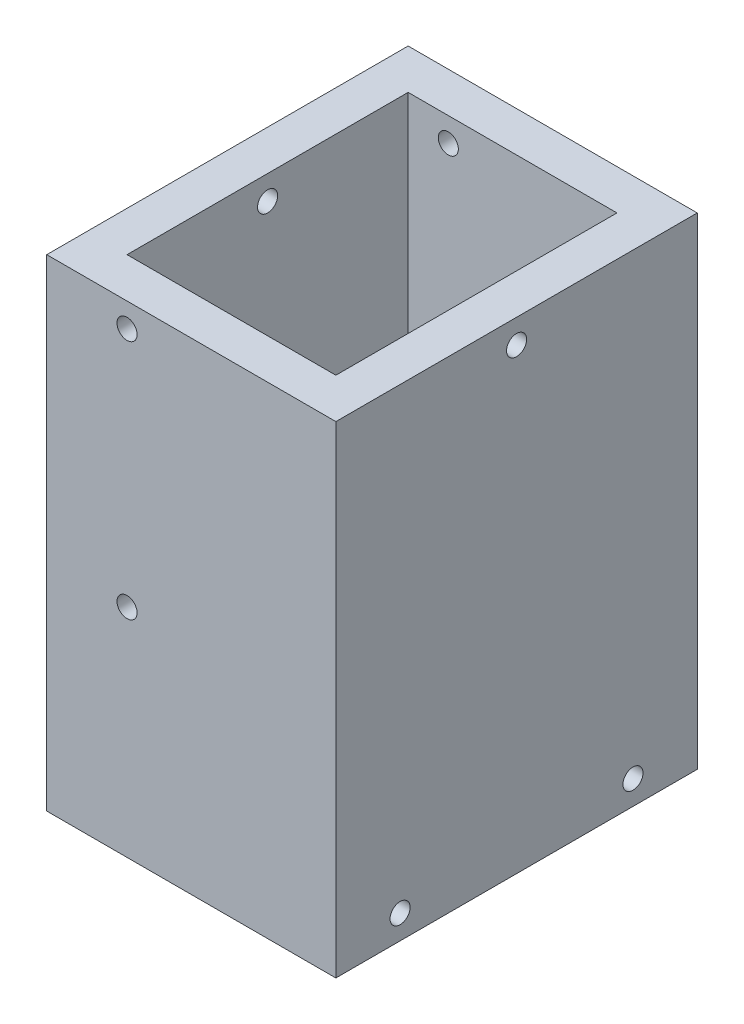
ISO-10303-21;
HEADER;
FILE_DESCRIPTION(('STEP AP214'),'2;1');
FILE_NAME('part.step','',(''),(''),'','','');
FILE_SCHEMA(('AUTOMOTIVE_DESIGN { 1 0 10303 214 1 1 1 1 }'));
ENDSEC;
DATA;
#1=APPLICATION_CONTEXT('core data for automotive mechanical design processes');
#2=APPLICATION_PROTOCOL_DEFINITION('international standard','automotive_design',2000,#1);
#3=PRODUCT_CONTEXT('',#1,'mechanical');
#4=PRODUCT('Part','Part','',(#3));
#5=PRODUCT_RELATED_PRODUCT_CATEGORY('part','',(#4));
#6=PRODUCT_DEFINITION_FORMATION('','',#4);
#7=PRODUCT_DEFINITION_CONTEXT('part definition',#1,'design');
#8=PRODUCT_DEFINITION('design','',#6,#7);
#9=PRODUCT_DEFINITION_SHAPE('','',#8);
#10=(LENGTH_UNIT() NAMED_UNIT(*) SI_UNIT(.MILLI.,.METRE.));
#11=(NAMED_UNIT(*) PLANE_ANGLE_UNIT() SI_UNIT($,.RADIAN.));
#12=(NAMED_UNIT(*) SI_UNIT($,.STERADIAN.) SOLID_ANGLE_UNIT());
#13=UNCERTAINTY_MEASURE_WITH_UNIT(LENGTH_MEASURE(1.E-05),#10,'distance_accuracy_value','');
#14=(GEOMETRIC_REPRESENTATION_CONTEXT(3) GLOBAL_UNCERTAINTY_ASSIGNED_CONTEXT((#13)) GLOBAL_UNIT_ASSIGNED_CONTEXT((#10,
#11,#12)) REPRESENTATION_CONTEXT('',''));
#15=CARTESIAN_POINT('',(0.,0.,0.));
#16=DIRECTION('',(0.,0.,1.));
#17=DIRECTION('',(1.,0.,0.));
#18=AXIS2_PLACEMENT_3D('',#15,#16,#17);
#19=CARTESIAN_POINT('',(0.,60.,0.));
#20=DIRECTION('',(0.,1.,0.));
#21=DIRECTION('',(0.,0.,1.));
#22=AXIS2_PLACEMENT_3D('',#19,#20,#21);
#23=PLANE('',#22);
#24=DIRECTION('',(0.,0.,-1.));
#25=VECTOR('',#24,1.);
#26=CARTESIAN_POINT('',(18.,60.,-22.5));
#27=LINE('',#26,#25);
#28=CARTESIAN_POINT('',(18.,60.,22.5));
#29=VERTEX_POINT('',#28);
#30=CARTESIAN_POINT('',(18.,60.,-22.5));
#31=VERTEX_POINT('',#30);
#32=EDGE_CURVE('E141',#29,#31,#27,.T.);
#33=ORIENTED_EDGE('',*,*,#32,.T.);
#34=DIRECTION('',(-1.,0.,0.));
#35=VECTOR('',#34,1.);
#36=CARTESIAN_POINT('',(-18.,60.,-22.5));
#37=LINE('',#36,#35);
#38=CARTESIAN_POINT('',(-18.,60.,-22.5));
#39=VERTEX_POINT('',#38);
#40=EDGE_CURVE('E144',#31,#39,#37,.T.);
#41=ORIENTED_EDGE('',*,*,#40,.T.);
#42=DIRECTION('',(0.,0.,1.));
#43=VECTOR('',#42,1.);
#44=CARTESIAN_POINT('',(-18.,60.,-22.5));
#45=LINE('',#44,#43);
#46=CARTESIAN_POINT('',(-18.,60.,22.5));
#47=VERTEX_POINT('',#46);
#48=EDGE_CURVE('E147',#39,#47,#45,.T.);
#49=ORIENTED_EDGE('',*,*,#48,.T.);
#50=DIRECTION('',(1.,0.,0.));
#51=VECTOR('',#50,1.);
#52=CARTESIAN_POINT('',(-18.,60.,22.5));
#53=LINE('',#52,#51);
#54=EDGE_CURVE('E149',#47,#29,#53,.T.);
#55=ORIENTED_EDGE('',*,*,#54,.T.);
#56=EDGE_LOOP('',(#33,#41,#49,#55));
#57=FACE_BOUND('',#56,.T.);
#58=DIRECTION('',(-1.,0.,0.));
#59=VECTOR('',#58,1.);
#60=CARTESIAN_POINT('',(-13.,60.,-17.5));
#61=LINE('',#60,#59);
#62=CARTESIAN_POINT('',(13.,60.,-17.5));
#63=VERTEX_POINT('',#62);
#64=CARTESIAN_POINT('',(-13.,60.,-17.5));
#65=VERTEX_POINT('',#64);
#66=EDGE_CURVE('E111',#63,#65,#61,.T.);
#67=ORIENTED_EDGE('',*,*,#66,.F.);
#68=DIRECTION('',(0.,0.,-1.));
#69=VECTOR('',#68,1.);
#70=CARTESIAN_POINT('',(13.,60.,17.5));
#71=LINE('',#70,#69);
#72=CARTESIAN_POINT('',(13.,60.,17.5));
#73=VERTEX_POINT('',#72);
#74=EDGE_CURVE('E103',#73,#63,#71,.T.);
#75=ORIENTED_EDGE('',*,*,#74,.F.);
#76=DIRECTION('',(1.,0.,0.));
#77=VECTOR('',#76,1.);
#78=CARTESIAN_POINT('',(-13.,60.,17.5));
#79=LINE('',#78,#77);
#80=CARTESIAN_POINT('',(-13.,60.,17.5));
#81=VERTEX_POINT('',#80);
#82=EDGE_CURVE('E125',#81,#73,#79,.T.);
#83=ORIENTED_EDGE('',*,*,#82,.F.);
#84=DIRECTION('',(0.,0.,1.));
#85=VECTOR('',#84,1.);
#86=CARTESIAN_POINT('',(-13.,60.,17.5));
#87=LINE('',#86,#85);
#88=EDGE_CURVE('E123',#65,#81,#87,.T.);
#89=ORIENTED_EDGE('',*,*,#88,.F.);
#90=EDGE_LOOP('',(#67,#75,#83,#89));
#91=FACE_BOUND('',#90,.T.);
#92=ADVANCED_FACE('F36',(#57,#91),#23,.T.);
#93=CARTESIAN_POINT('',(0.,0.,0.));
#94=DIRECTION('',(0.,1.,0.));
#95=DIRECTION('',(0.,0.,1.));
#96=AXIS2_PLACEMENT_3D('',#93,#94,#95);
#97=PLANE('',#96);
#98=DIRECTION('',(0.,0.,-1.));
#99=VECTOR('',#98,1.);
#100=CARTESIAN_POINT('',(18.,0.,-22.5));
#101=LINE('',#100,#99);
#102=CARTESIAN_POINT('',(18.,0.,22.5));
#103=VERTEX_POINT('',#102);
#104=CARTESIAN_POINT('',(18.,0.,-22.5));
#105=VERTEX_POINT('',#104);
#106=EDGE_CURVE('E119',#103,#105,#101,.T.);
#107=ORIENTED_EDGE('',*,*,#106,.F.);
#108=DIRECTION('',(1.,0.,0.));
#109=VECTOR('',#108,1.);
#110=CARTESIAN_POINT('',(-18.,0.,22.5));
#111=LINE('',#110,#109);
#112=CARTESIAN_POINT('',(-18.,0.,22.5));
#113=VERTEX_POINT('',#112);
#114=EDGE_CURVE('E145',#113,#103,#111,.T.);
#115=ORIENTED_EDGE('',*,*,#114,.F.);
#116=DIRECTION('',(0.,0.,1.));
#117=VECTOR('',#116,1.);
#118=CARTESIAN_POINT('',(-18.,0.,-22.5));
#119=LINE('',#118,#117);
#120=CARTESIAN_POINT('',(-18.,0.,-22.5));
#121=VERTEX_POINT('',#120);
#122=EDGE_CURVE('E156',#121,#113,#119,.T.);
#123=ORIENTED_EDGE('',*,*,#122,.F.);
#124=DIRECTION('',(-1.,0.,0.));
#125=VECTOR('',#124,1.);
#126=CARTESIAN_POINT('',(-18.,0.,-22.5));
#127=LINE('',#126,#125);
#128=EDGE_CURVE('E154',#105,#121,#127,.T.);
#129=ORIENTED_EDGE('',*,*,#128,.F.);
#130=EDGE_LOOP('',(#107,#115,#123,#129));
#131=FACE_BOUND('',#130,.T.);
#132=DIRECTION('',(0.,0.,-1.));
#133=VECTOR('',#132,1.);
#134=CARTESIAN_POINT('',(13.,0.,17.5));
#135=LINE('',#134,#133);
#136=CARTESIAN_POINT('',(13.,0.,17.5));
#137=VERTEX_POINT('',#136);
#138=CARTESIAN_POINT('',(13.,0.,-17.5));
#139=VERTEX_POINT('',#138);
#140=EDGE_CURVE('E61',#137,#139,#135,.T.);
#141=ORIENTED_EDGE('',*,*,#140,.T.);
#142=DIRECTION('',(-1.,0.,0.));
#143=VECTOR('',#142,1.);
#144=CARTESIAN_POINT('',(-13.,0.,-17.5));
#145=LINE('',#144,#143);
#146=CARTESIAN_POINT('',(-13.,0.,-17.5));
#147=VERTEX_POINT('',#146);
#148=EDGE_CURVE('E118',#139,#147,#145,.T.);
#149=ORIENTED_EDGE('',*,*,#148,.T.);
#150=DIRECTION('',(0.,0.,1.));
#151=VECTOR('',#150,1.);
#152=CARTESIAN_POINT('',(-13.,0.,17.5));
#153=LINE('',#152,#151);
#154=CARTESIAN_POINT('',(-13.,0.,17.5));
#155=VERTEX_POINT('',#154);
#156=EDGE_CURVE('E133',#147,#155,#153,.T.);
#157=ORIENTED_EDGE('',*,*,#156,.T.);
#158=DIRECTION('',(1.,0.,0.));
#159=VECTOR('',#158,1.);
#160=CARTESIAN_POINT('',(-13.,0.,17.5));
#161=LINE('',#160,#159);
#162=EDGE_CURVE('E112',#155,#137,#161,.T.);
#163=ORIENTED_EDGE('',*,*,#162,.T.);
#164=EDGE_LOOP('',(#141,#149,#157,#163));
#165=FACE_BOUND('',#164,.T.);
#166=ADVANCED_FACE('F240',(#131,#165),#97,.F.);
#167=CARTESIAN_POINT('',(18.,60.,-22.5));
#168=DIRECTION('',(-1.,0.,0.));
#169=DIRECTION('',(0.,0.,1.));
#170=AXIS2_PLACEMENT_3D('',#167,#168,#169);
#171=PLANE('',#170);
#172=CARTESIAN_POINT('',(18.,57.,0.));
#173=DIRECTION('',(1.,0.,0.));
#174=DIRECTION('',(0.,0.,-1.));
#175=AXIS2_PLACEMENT_3D('',#172,#173,#174);
#176=CIRCLE('',#175,1.25);
#177=CARTESIAN_POINT('',(18.,57.,-1.25));
#178=VERTEX_POINT('',#177);
#179=EDGE_CURVE('E319',#178,#178,#176,.T.);
#180=ORIENTED_EDGE('',*,*,#179,.F.);
#181=EDGE_LOOP('',(#180));
#182=FACE_BOUND('',#181,.T.);
#183=CARTESIAN_POINT('',(18.,3.,-14.5));
#184=DIRECTION('',(-1.,0.,0.));
#185=DIRECTION('',(0.,0.,1.));
#186=AXIS2_PLACEMENT_3D('',#183,#184,#185);
#187=CIRCLE('',#186,1.25);
#188=CARTESIAN_POINT('',(18.,3.,-13.25));
#189=VERTEX_POINT('',#188);
#190=EDGE_CURVE('E174',#189,#189,#187,.T.);
#191=ORIENTED_EDGE('',*,*,#190,.T.);
#192=EDGE_LOOP('',(#191));
#193=FACE_BOUND('',#192,.T.);
#194=CARTESIAN_POINT('',(18.,3.,14.5));
#195=DIRECTION('',(-1.,0.,0.));
#196=DIRECTION('',(0.,0.,1.));
#197=AXIS2_PLACEMENT_3D('',#194,#195,#196);
#198=CIRCLE('',#197,1.25);
#199=CARTESIAN_POINT('',(18.,3.,15.75));
#200=VERTEX_POINT('',#199);
#201=EDGE_CURVE('E169',#200,#200,#198,.T.);
#202=ORIENTED_EDGE('',*,*,#201,.T.);
#203=EDGE_LOOP('',(#202));
#204=FACE_BOUND('',#203,.T.);
#205=ORIENTED_EDGE('',*,*,#106,.T.);
#206=DIRECTION('',(0.,-1.,0.));
#207=VECTOR('',#206,1.);
#208=CARTESIAN_POINT('',(18.,60.,-22.5));
#209=LINE('',#208,#207);
#210=EDGE_CURVE('E11',#31,#105,#209,.T.);
#211=ORIENTED_EDGE('',*,*,#210,.F.);
#212=ORIENTED_EDGE('',*,*,#32,.F.);
#213=DIRECTION('',(0.,-1.,0.));
#214=VECTOR('',#213,1.);
#215=CARTESIAN_POINT('',(18.,60.,22.5));
#216=LINE('',#215,#214);
#217=EDGE_CURVE('E151',#29,#103,#216,.T.);
#218=ORIENTED_EDGE('',*,*,#217,.T.);
#219=EDGE_LOOP('',(#205,#211,#212,#218));
#220=FACE_BOUND('',#219,.T.);
#221=ADVANCED_FACE('F38',(#182,#193,#204,#220),#171,.F.);
#222=CARTESIAN_POINT('',(-18.,60.,-22.5));
#223=DIRECTION('',(0.,0.,1.));
#224=DIRECTION('',(1.,0.,0.));
#225=AXIS2_PLACEMENT_3D('',#222,#223,#224);
#226=PLANE('',#225);
#227=CARTESIAN_POINT('',(-7.99999999999999,27.,-22.5));
#228=DIRECTION('',(0.,0.,1.));
#229=DIRECTION('',(1.,0.,0.));
#230=AXIS2_PLACEMENT_3D('',#227,#228,#229);
#231=CIRCLE('',#230,1.25);
#232=CARTESIAN_POINT('',(-6.74999999999999,27.,-22.5));
#233=VERTEX_POINT('',#232);
#234=EDGE_CURVE('E182',#233,#233,#231,.T.);
#235=ORIENTED_EDGE('',*,*,#234,.T.);
#236=EDGE_LOOP('',(#235));
#237=FACE_BOUND('',#236,.T.);
#238=CARTESIAN_POINT('',(-7.99999999999999,57.,-22.5));
#239=DIRECTION('',(0.,0.,1.));
#240=DIRECTION('',(1.,0.,0.));
#241=AXIS2_PLACEMENT_3D('',#238,#239,#240);
#242=CIRCLE('',#241,1.25);
#243=CARTESIAN_POINT('',(-6.74999999999999,57.,-22.5));
#244=VERTEX_POINT('',#243);
#245=EDGE_CURVE('E178',#244,#244,#242,.T.);
#246=ORIENTED_EDGE('',*,*,#245,.T.);
#247=EDGE_LOOP('',(#246));
#248=FACE_BOUND('',#247,.T.);
#249=ORIENTED_EDGE('',*,*,#128,.T.);
#250=DIRECTION('',(0.,-1.,0.));
#251=VECTOR('',#250,1.);
#252=CARTESIAN_POINT('',(-18.,60.,-22.5));
#253=LINE('',#252,#251);
#254=EDGE_CURVE('E45',#39,#121,#253,.T.);
#255=ORIENTED_EDGE('',*,*,#254,.F.);
#256=ORIENTED_EDGE('',*,*,#40,.F.);
#257=ORIENTED_EDGE('',*,*,#210,.T.);
#258=EDGE_LOOP('',(#249,#255,#256,#257));
#259=FACE_BOUND('',#258,.T.);
#260=ADVANCED_FACE('F249',(#237,#248,#259),#226,.F.);
#261=CARTESIAN_POINT('',(-18.,60.,-22.5));
#262=DIRECTION('',(1.,0.,0.));
#263=DIRECTION('',(0.,0.,-1.));
#264=AXIS2_PLACEMENT_3D('',#261,#262,#263);
#265=PLANE('',#264);
#266=CARTESIAN_POINT('',(-18.,57.,0.));
#267=DIRECTION('',(1.,0.,0.));
#268=DIRECTION('',(0.,0.,-1.));
#269=AXIS2_PLACEMENT_3D('',#266,#267,#268);
#270=CIRCLE('',#269,1.25);
#271=CARTESIAN_POINT('',(-18.,57.,-1.25));
#272=VERTEX_POINT('',#271);
#273=EDGE_CURVE('E318',#272,#272,#270,.T.);
#274=ORIENTED_EDGE('',*,*,#273,.T.);
#275=EDGE_LOOP('',(#274));
#276=FACE_BOUND('',#275,.T.);
#277=CARTESIAN_POINT('',(-18.,3.,-14.5));
#278=DIRECTION('',(-1.,0.,0.));
#279=DIRECTION('',(0.,0.,1.));
#280=AXIS2_PLACEMENT_3D('',#277,#278,#279);
#281=CIRCLE('',#280,1.25);
#282=CARTESIAN_POINT('',(-18.,3.,-13.25));
#283=VERTEX_POINT('',#282);
#284=EDGE_CURVE('E205',#283,#283,#281,.T.);
#285=ORIENTED_EDGE('',*,*,#284,.F.);
#286=EDGE_LOOP('',(#285));
#287=FACE_BOUND('',#286,.T.);
#288=CARTESIAN_POINT('',(-18.,3.,14.5));
#289=DIRECTION('',(-1.,0.,0.));
#290=DIRECTION('',(0.,0.,1.));
#291=AXIS2_PLACEMENT_3D('',#288,#289,#290);
#292=CIRCLE('',#291,1.25);
#293=CARTESIAN_POINT('',(-18.,3.,15.75));
#294=VERTEX_POINT('',#293);
#295=EDGE_CURVE('E212',#294,#294,#292,.T.);
#296=ORIENTED_EDGE('',*,*,#295,.F.);
#297=EDGE_LOOP('',(#296));
#298=FACE_BOUND('',#297,.T.);
#299=ORIENTED_EDGE('',*,*,#122,.T.);
#300=DIRECTION('',(0.,-1.,0.));
#301=VECTOR('',#300,1.);
#302=CARTESIAN_POINT('',(-18.,60.,22.5));
#303=LINE('',#302,#301);
#304=EDGE_CURVE('E161',#47,#113,#303,.T.);
#305=ORIENTED_EDGE('',*,*,#304,.F.);
#306=ORIENTED_EDGE('',*,*,#48,.F.);
#307=ORIENTED_EDGE('',*,*,#254,.T.);
#308=EDGE_LOOP('',(#299,#305,#306,#307));
#309=FACE_BOUND('',#308,.T.);
#310=ADVANCED_FACE('F233',(#276,#287,#298,#309),#265,.F.);
#311=CARTESIAN_POINT('',(-18.,60.,22.5));
#312=DIRECTION('',(0.,0.,-1.));
#313=DIRECTION('',(-1.,0.,0.));
#314=AXIS2_PLACEMENT_3D('',#311,#312,#313);
#315=PLANE('',#314);
#316=CARTESIAN_POINT('',(-7.99999999999999,27.,22.5));
#317=DIRECTION('',(0.,0.,1.));
#318=DIRECTION('',(1.,0.,0.));
#319=AXIS2_PLACEMENT_3D('',#316,#317,#318);
#320=CIRCLE('',#319,1.25);
#321=CARTESIAN_POINT('',(-6.74999999999999,27.,22.5));
#322=VERTEX_POINT('',#321);
#323=EDGE_CURVE('E189',#322,#322,#320,.T.);
#324=ORIENTED_EDGE('',*,*,#323,.F.);
#325=EDGE_LOOP('',(#324));
#326=FACE_BOUND('',#325,.T.);
#327=CARTESIAN_POINT('',(-7.99999999999999,57.,22.5));
#328=DIRECTION('',(0.,0.,1.));
#329=DIRECTION('',(1.,0.,0.));
#330=AXIS2_PLACEMENT_3D('',#327,#328,#329);
#331=CIRCLE('',#330,1.25);
#332=CARTESIAN_POINT('',(-6.74999999999999,57.,22.5));
#333=VERTEX_POINT('',#332);
#334=EDGE_CURVE('E186',#333,#333,#331,.T.);
#335=ORIENTED_EDGE('',*,*,#334,.F.);
#336=EDGE_LOOP('',(#335));
#337=FACE_BOUND('',#336,.T.);
#338=ORIENTED_EDGE('',*,*,#114,.T.);
#339=ORIENTED_EDGE('',*,*,#217,.F.);
#340=ORIENTED_EDGE('',*,*,#54,.F.);
#341=ORIENTED_EDGE('',*,*,#304,.T.);
#342=EDGE_LOOP('',(#338,#339,#340,#341));
#343=FACE_BOUND('',#342,.T.);
#344=ADVANCED_FACE('F223',(#326,#337,#343),#315,.F.);
#345=CARTESIAN_POINT('',(13.,60.,17.5));
#346=DIRECTION('',(-1.,0.,0.));
#347=DIRECTION('',(0.,0.,1.));
#348=AXIS2_PLACEMENT_3D('',#345,#346,#347);
#349=PLANE('',#348);
#350=CARTESIAN_POINT('',(13.,57.,0.));
#351=DIRECTION('',(-1.,0.,0.));
#352=DIRECTION('',(0.,0.,1.));
#353=AXIS2_PLACEMENT_3D('',#350,#351,#352);
#354=CIRCLE('',#353,1.25);
#355=CARTESIAN_POINT('',(13.,57.,1.25));
#356=VERTEX_POINT('',#355);
#357=EDGE_CURVE('E194',#356,#356,#354,.T.);
#358=ORIENTED_EDGE('',*,*,#357,.F.);
#359=EDGE_LOOP('',(#358));
#360=FACE_BOUND('',#359,.T.);
#361=CARTESIAN_POINT('',(13.,3.,-14.5));
#362=DIRECTION('',(-1.,0.,0.));
#363=DIRECTION('',(0.,0.,1.));
#364=AXIS2_PLACEMENT_3D('',#361,#362,#363);
#365=CIRCLE('',#364,1.25);
#366=CARTESIAN_POINT('',(13.,3.,-13.25));
#367=VERTEX_POINT('',#366);
#368=EDGE_CURVE('E173',#367,#367,#365,.T.);
#369=ORIENTED_EDGE('',*,*,#368,.F.);
#370=EDGE_LOOP('',(#369));
#371=FACE_BOUND('',#370,.T.);
#372=CARTESIAN_POINT('',(13.,3.,14.5));
#373=DIRECTION('',(-1.,0.,0.));
#374=DIRECTION('',(0.,0.,1.));
#375=AXIS2_PLACEMENT_3D('',#372,#373,#374);
#376=CIRCLE('',#375,1.25);
#377=CARTESIAN_POINT('',(13.,3.,15.75));
#378=VERTEX_POINT('',#377);
#379=EDGE_CURVE('E131',#378,#378,#376,.T.);
#380=ORIENTED_EDGE('',*,*,#379,.F.);
#381=EDGE_LOOP('',(#380));
#382=FACE_BOUND('',#381,.T.);
#383=ORIENTED_EDGE('',*,*,#140,.F.);
#384=DIRECTION('',(0.,-1.,0.));
#385=VECTOR('',#384,1.);
#386=CARTESIAN_POINT('',(13.,60.,17.5));
#387=LINE('',#386,#385);
#388=EDGE_CURVE('E107',#73,#137,#387,.T.);
#389=ORIENTED_EDGE('',*,*,#388,.F.);
#390=ORIENTED_EDGE('',*,*,#74,.T.);
#391=DIRECTION('',(0.,-1.,0.));
#392=VECTOR('',#391,1.);
#393=CARTESIAN_POINT('',(13.,60.,-17.5));
#394=LINE('',#393,#392);
#395=EDGE_CURVE('E106',#63,#139,#394,.T.);
#396=ORIENTED_EDGE('',*,*,#395,.T.);
#397=EDGE_LOOP('',(#383,#389,#390,#396));
#398=FACE_BOUND('',#397,.T.);
#399=ADVANCED_FACE('F105',(#360,#371,#382,#398),#349,.T.);
#400=CARTESIAN_POINT('',(-13.,60.,-17.5));
#401=DIRECTION('',(0.,0.,1.));
#402=DIRECTION('',(1.,0.,0.));
#403=AXIS2_PLACEMENT_3D('',#400,#401,#402);
#404=PLANE('',#403);
#405=CARTESIAN_POINT('',(-7.99999999999999,27.,-17.5));
#406=DIRECTION('',(0.,0.,1.));
#407=DIRECTION('',(1.,0.,0.));
#408=AXIS2_PLACEMENT_3D('',#405,#406,#407);
#409=CIRCLE('',#408,1.25);
#410=CARTESIAN_POINT('',(-6.74999999999999,27.,-17.5));
#411=VERTEX_POINT('',#410);
#412=EDGE_CURVE('E181',#411,#411,#409,.T.);
#413=ORIENTED_EDGE('',*,*,#412,.F.);
#414=EDGE_LOOP('',(#413));
#415=FACE_BOUND('',#414,.T.);
#416=CARTESIAN_POINT('',(-7.99999999999999,57.,-17.5));
#417=DIRECTION('',(0.,0.,1.));
#418=DIRECTION('',(1.,0.,0.));
#419=AXIS2_PLACEMENT_3D('',#416,#417,#418);
#420=CIRCLE('',#419,1.25);
#421=CARTESIAN_POINT('',(-6.74999999999999,57.,-17.5));
#422=VERTEX_POINT('',#421);
#423=EDGE_CURVE('E177',#422,#422,#420,.T.);
#424=ORIENTED_EDGE('',*,*,#423,.F.);
#425=EDGE_LOOP('',(#424));
#426=FACE_BOUND('',#425,.T.);
#427=ORIENTED_EDGE('',*,*,#148,.F.);
#428=ORIENTED_EDGE('',*,*,#395,.F.);
#429=ORIENTED_EDGE('',*,*,#66,.T.);
#430=DIRECTION('',(0.,-1.,0.));
#431=VECTOR('',#430,1.);
#432=CARTESIAN_POINT('',(-13.,60.,-17.5));
#433=LINE('',#432,#431);
#434=EDGE_CURVE('E120',#65,#147,#433,.T.);
#435=ORIENTED_EDGE('',*,*,#434,.T.);
#436=EDGE_LOOP('',(#427,#428,#429,#435));
#437=FACE_BOUND('',#436,.T.);
#438=ADVANCED_FACE('F115',(#415,#426,#437),#404,.T.);
#439=CARTESIAN_POINT('',(-13.,60.,17.5));
#440=DIRECTION('',(1.,0.,0.));
#441=DIRECTION('',(0.,0.,-1.));
#442=AXIS2_PLACEMENT_3D('',#439,#440,#441);
#443=PLANE('',#442);
#444=CARTESIAN_POINT('',(-13.,57.,0.));
#445=DIRECTION('',(1.,0.,0.));
#446=DIRECTION('',(0.,0.,-1.));
#447=AXIS2_PLACEMENT_3D('',#444,#445,#446);
#448=CIRCLE('',#447,1.25);
#449=CARTESIAN_POINT('',(-13.,57.,-1.25));
#450=VERTEX_POINT('',#449);
#451=EDGE_CURVE('E40',#450,#450,#448,.T.);
#452=ORIENTED_EDGE('',*,*,#451,.F.);
#453=EDGE_LOOP('',(#452));
#454=FACE_BOUND('',#453,.T.);
#455=CARTESIAN_POINT('',(-13.,3.,-14.5));
#456=DIRECTION('',(1.,0.,0.));
#457=DIRECTION('',(0.,0.,-1.));
#458=AXIS2_PLACEMENT_3D('',#455,#456,#457);
#459=CIRCLE('',#458,1.25);
#460=CARTESIAN_POINT('',(-13.,3.,-15.75));
#461=VERTEX_POINT('',#460);
#462=EDGE_CURVE('E170',#461,#461,#459,.T.);
#463=ORIENTED_EDGE('',*,*,#462,.F.);
#464=EDGE_LOOP('',(#463));
#465=FACE_BOUND('',#464,.T.);
#466=CARTESIAN_POINT('',(-13.,3.,14.5));
#467=DIRECTION('',(1.,0.,0.));
#468=DIRECTION('',(0.,0.,-1.));
#469=AXIS2_PLACEMENT_3D('',#466,#467,#468);
#470=CIRCLE('',#469,1.25);
#471=CARTESIAN_POINT('',(-13.,3.,13.25));
#472=VERTEX_POINT('',#471);
#473=EDGE_CURVE('E166',#472,#472,#470,.T.);
#474=ORIENTED_EDGE('',*,*,#473,.F.);
#475=EDGE_LOOP('',(#474));
#476=FACE_BOUND('',#475,.T.);
#477=ORIENTED_EDGE('',*,*,#156,.F.);
#478=ORIENTED_EDGE('',*,*,#434,.F.);
#479=ORIENTED_EDGE('',*,*,#88,.T.);
#480=DIRECTION('',(0.,-1.,0.));
#481=VECTOR('',#480,1.);
#482=CARTESIAN_POINT('',(-13.,60.,17.5));
#483=LINE('',#482,#481);
#484=EDGE_CURVE('E53',#81,#155,#483,.T.);
#485=ORIENTED_EDGE('',*,*,#484,.T.);
#486=EDGE_LOOP('',(#477,#478,#479,#485));
#487=FACE_BOUND('',#486,.T.);
#488=ADVANCED_FACE('F230',(#454,#465,#476,#487),#443,.T.);
#489=CARTESIAN_POINT('',(-13.,60.,17.5));
#490=DIRECTION('',(0.,0.,-1.));
#491=DIRECTION('',(-1.,0.,0.));
#492=AXIS2_PLACEMENT_3D('',#489,#490,#491);
#493=PLANE('',#492);
#494=CARTESIAN_POINT('',(-7.99999999999999,27.,17.5));
#495=DIRECTION('',(0.,0.,-1.));
#496=DIRECTION('',(-1.,0.,0.));
#497=AXIS2_PLACEMENT_3D('',#494,#495,#496);
#498=CIRCLE('',#497,1.25);
#499=CARTESIAN_POINT('',(-6.74999999999999,27.,17.5));
#500=VERTEX_POINT('',#499);
#501=EDGE_CURVE('E179',#500,#500,#498,.T.);
#502=ORIENTED_EDGE('',*,*,#501,.F.);
#503=EDGE_LOOP('',(#502));
#504=FACE_BOUND('',#503,.T.);
#505=CARTESIAN_POINT('',(-7.99999999999999,57.,17.5));
#506=DIRECTION('',(0.,0.,-1.));
#507=DIRECTION('',(-1.,0.,0.));
#508=AXIS2_PLACEMENT_3D('',#505,#506,#507);
#509=CIRCLE('',#508,1.25);
#510=CARTESIAN_POINT('',(-6.74999999999999,57.,17.5));
#511=VERTEX_POINT('',#510);
#512=EDGE_CURVE('E175',#511,#511,#509,.T.);
#513=ORIENTED_EDGE('',*,*,#512,.F.);
#514=EDGE_LOOP('',(#513));
#515=FACE_BOUND('',#514,.T.);
#516=ORIENTED_EDGE('',*,*,#162,.F.);
#517=ORIENTED_EDGE('',*,*,#484,.F.);
#518=ORIENTED_EDGE('',*,*,#82,.T.);
#519=ORIENTED_EDGE('',*,*,#388,.T.);
#520=EDGE_LOOP('',(#516,#517,#518,#519));
#521=FACE_BOUND('',#520,.T.);
#522=ADVANCED_FACE('F274',(#504,#515,#521),#493,.T.);
#523=CARTESIAN_POINT('',(18.,3.,14.5));
#524=DIRECTION('',(-1.,0.,0.));
#525=DIRECTION('',(0.,0.,1.));
#526=AXIS2_PLACEMENT_3D('',#523,#524,#525);
#527=CYLINDRICAL_SURFACE('',#526,1.25);
#528=ORIENTED_EDGE('',*,*,#473,.T.);
#529=EDGE_LOOP('',(#528));
#530=FACE_BOUND('',#529,.T.);
#531=ORIENTED_EDGE('',*,*,#295,.T.);
#532=EDGE_LOOP('',(#531));
#533=FACE_BOUND('',#532,.T.);
#534=ADVANCED_FACE('F276',(#530,#533),#527,.F.);
#535=ORIENTED_EDGE('',*,*,#379,.T.);
#536=EDGE_LOOP('',(#535));
#537=FACE_BOUND('',#536,.T.);
#538=ORIENTED_EDGE('',*,*,#201,.F.);
#539=EDGE_LOOP('',(#538));
#540=FACE_BOUND('',#539,.T.);
#541=ADVANCED_FACE('F219',(#537,#540),#527,.F.);
#542=CARTESIAN_POINT('',(18.,3.,-14.5));
#543=DIRECTION('',(-1.,0.,0.));
#544=DIRECTION('',(0.,0.,1.));
#545=AXIS2_PLACEMENT_3D('',#542,#543,#544);
#546=CYLINDRICAL_SURFACE('',#545,1.25);
#547=ORIENTED_EDGE('',*,*,#462,.T.);
#548=EDGE_LOOP('',(#547));
#549=FACE_BOUND('',#548,.T.);
#550=ORIENTED_EDGE('',*,*,#284,.T.);
#551=EDGE_LOOP('',(#550));
#552=FACE_BOUND('',#551,.T.);
#553=ADVANCED_FACE('F289',(#549,#552),#546,.F.);
#554=ORIENTED_EDGE('',*,*,#368,.T.);
#555=EDGE_LOOP('',(#554));
#556=FACE_BOUND('',#555,.T.);
#557=ORIENTED_EDGE('',*,*,#190,.F.);
#558=EDGE_LOOP('',(#557));
#559=FACE_BOUND('',#558,.T.);
#560=ADVANCED_FACE('F292',(#556,#559),#546,.F.);
#561=CARTESIAN_POINT('',(-7.99999999999999,57.,-22.5));
#562=DIRECTION('',(0.,0.,1.));
#563=DIRECTION('',(1.,0.,0.));
#564=AXIS2_PLACEMENT_3D('',#561,#562,#563);
#565=CYLINDRICAL_SURFACE('',#564,1.25);
#566=CARTESIAN_POINT('',(-6.74999999999999,57.,17.5));
#567=CARTESIAN_POINT('',(-6.74999999999999,57.,17.5520833333333));
#568=CARTESIAN_POINT('',(-6.74999999999999,57.,17.6041666666667));
#569=CARTESIAN_POINT('',(-6.74999999999999,57.,17.7083333333333));
#570=CARTESIAN_POINT('',(-6.74999999999999,57.,17.7604166666667));
#571=CARTESIAN_POINT('',(-6.74999999999999,57.,17.8645833333333));
#572=CARTESIAN_POINT('',(-6.74999999999999,57.,17.9166666666667));
#573=CARTESIAN_POINT('',(-6.74999999999999,57.,18.0208333333333));
#574=CARTESIAN_POINT('',(-6.74999999999999,57.,18.0729166666667));
#575=CARTESIAN_POINT('',(-6.74999999999999,57.,18.1770833333333));
#576=CARTESIAN_POINT('',(-6.74999999999999,57.,18.2291666666667));
#577=CARTESIAN_POINT('',(-6.74999999999999,57.,18.3333333333333));
#578=CARTESIAN_POINT('',(-6.74999999999999,57.,18.3854166666667));
#579=CARTESIAN_POINT('',(-6.74999999999999,57.,18.4895833333333));
#580=CARTESIAN_POINT('',(-6.74999999999999,57.,18.5416666666667));
#581=CARTESIAN_POINT('',(-6.74999999999999,57.,18.6458333333333));
#582=CARTESIAN_POINT('',(-6.74999999999999,57.,18.6979166666667));
#583=CARTESIAN_POINT('',(-6.74999999999999,57.,18.8020833333333));
#584=CARTESIAN_POINT('',(-6.74999999999999,57.,18.8541666666667));
#585=CARTESIAN_POINT('',(-6.74999999999999,57.,18.9583333333333));
#586=CARTESIAN_POINT('',(-6.74999999999999,57.,19.0104166666667));
#587=CARTESIAN_POINT('',(-6.74999999999999,57.,19.1145833333333));
#588=CARTESIAN_POINT('',(-6.74999999999999,57.,19.1666666666667));
#589=CARTESIAN_POINT('',(-6.74999999999999,57.,19.2708333333333));
#590=CARTESIAN_POINT('',(-6.74999999999999,57.,19.3229166666667));
#591=CARTESIAN_POINT('',(-6.74999999999999,57.,19.4270833333333));
#592=CARTESIAN_POINT('',(-6.74999999999999,57.,19.4791666666667));
#593=CARTESIAN_POINT('',(-6.74999999999999,57.,19.5833333333333));
#594=CARTESIAN_POINT('',(-6.74999999999999,57.,19.6354166666667));
#595=CARTESIAN_POINT('',(-6.74999999999999,57.,19.7395833333333));
#596=CARTESIAN_POINT('',(-6.74999999999999,57.,19.7916666666667));
#597=CARTESIAN_POINT('',(-6.74999999999999,57.,19.8958333333333));
#598=CARTESIAN_POINT('',(-6.74999999999999,57.,19.9479166666667));
#599=CARTESIAN_POINT('',(-6.74999999999999,57.,20.0520833333333));
#600=CARTESIAN_POINT('',(-6.74999999999999,57.,20.1041666666667));
#601=CARTESIAN_POINT('',(-6.74999999999999,57.,20.2083333333333));
#602=CARTESIAN_POINT('',(-6.74999999999999,57.,20.2604166666667));
#603=CARTESIAN_POINT('',(-6.74999999999999,57.,20.3645833333333));
#604=CARTESIAN_POINT('',(-6.74999999999999,57.,20.4166666666667));
#605=CARTESIAN_POINT('',(-6.74999999999999,57.,20.5208333333333));
#606=CARTESIAN_POINT('',(-6.74999999999999,57.,20.5729166666667));
#607=CARTESIAN_POINT('',(-6.74999999999999,57.,20.6770833333333));
#608=CARTESIAN_POINT('',(-6.74999999999999,57.,20.7291666666667));
#609=CARTESIAN_POINT('',(-6.74999999999999,57.,20.8333333333333));
#610=CARTESIAN_POINT('',(-6.74999999999999,57.,20.8854166666667));
#611=CARTESIAN_POINT('',(-6.74999999999999,57.,20.9895833333333));
#612=CARTESIAN_POINT('',(-6.74999999999999,57.,21.0416666666667));
#613=CARTESIAN_POINT('',(-6.74999999999999,57.,21.1458333333333));
#614=CARTESIAN_POINT('',(-6.74999999999999,57.,21.1979166666667));
#615=CARTESIAN_POINT('',(-6.74999999999999,57.,21.3020833333333));
#616=CARTESIAN_POINT('',(-6.74999999999999,57.,21.3541666666667));
#617=CARTESIAN_POINT('',(-6.74999999999999,57.,21.4583333333333));
#618=CARTESIAN_POINT('',(-6.74999999999999,57.,21.5104166666667));
#619=CARTESIAN_POINT('',(-6.74999999999999,57.,21.6145833333333));
#620=CARTESIAN_POINT('',(-6.74999999999999,57.,21.6666666666667));
#621=CARTESIAN_POINT('',(-6.74999999999999,57.,21.7708333333333));
#622=CARTESIAN_POINT('',(-6.74999999999999,57.,21.8229166666667));
#623=CARTESIAN_POINT('',(-6.74999999999999,57.,21.9270833333333));
#624=CARTESIAN_POINT('',(-6.74999999999999,57.,21.9791666666667));
#625=CARTESIAN_POINT('',(-6.74999999999999,57.,22.0833333333333));
#626=CARTESIAN_POINT('',(-6.74999999999999,57.,22.1354166666667));
#627=CARTESIAN_POINT('',(-6.74999999999999,57.,22.2395833333333));
#628=CARTESIAN_POINT('',(-6.74999999999999,57.,22.2916666666667));
#629=CARTESIAN_POINT('',(-6.74999999999999,57.,22.3958333333333));
#630=CARTESIAN_POINT('',(-6.74999999999999,57.,22.4479166666667));
#631=CARTESIAN_POINT('',(-6.74999999999999,57.,22.5));
#632=B_SPLINE_CURVE_WITH_KNOTS('',3,(#566,#567,#568,#569,#570,#571,#572,#573,#574,#575,#576,
#577,#578,#579,#580,#581,#582,#583,#584,#585,#586,#587,#588,#589,#590,#591,#592,#593,#594,#595,
#596,#597,#598,#599,#600,#601,#602,#603,#604,#605,#606,#607,#608,#609,#610,#611,#612,#613,#614,
#615,#616,#617,#618,#619,#620,#621,#622,#623,#624,#625,#626,#627,#628,#629,#630,#631),
.UNSPECIFIED.,.F.,.F.,(4,2,2,2,2,2,2,2,2,2,2,2,2,2,2,2,2,2,2,2,2,2,2,2,2,2,2,2,2,2,2,2,4),(0.,
0.156249999999997,0.3125,0.468749999999997,0.625000000000001,0.781249999999997,
0.937500000000001,1.09375,1.25,1.40625,1.56249999999999,1.71875,1.87499999999999,2.03125,2.1875,
2.34375,2.5,2.65624999999999,2.8125,2.96874999999999,3.125,3.28124999999999,3.4375,
3.59374999999999,3.74999999999999,3.90624999999999,4.06249999999999,4.21874999999999,
4.37499999999999,4.53124999999999,4.68749999999999,4.84374999999999,4.99999999999999),.UNSPECIFIED.);
#633=EDGE_CURVE('BSEAM294',#511,#333,#632,.T.);
#634=ORIENTED_EDGE('',*,*,#512,.T.);
#635=ORIENTED_EDGE('',*,*,#334,.T.);
#636=ORIENTED_EDGE('',*,*,#633,.T.);
#637=ORIENTED_EDGE('',*,*,#633,.F.);
#638=EDGE_LOOP('',(#634,#636,#635,#637));
#639=FACE_BOUND('',#638,.T.);
#640=ADVANCED_FACE('F294',(#639),#565,.F.);
#641=CARTESIAN_POINT('',(-6.74999999999999,57.,-17.5));
#642=CARTESIAN_POINT('',(-6.74999999999999,57.,-17.5520833333333));
#643=CARTESIAN_POINT('',(-6.74999999999999,57.,-17.6041666666667));
#644=CARTESIAN_POINT('',(-6.74999999999999,57.,-17.7083333333333));
#645=CARTESIAN_POINT('',(-6.74999999999999,57.,-17.7604166666667));
#646=CARTESIAN_POINT('',(-6.74999999999999,57.,-17.8645833333333));
#647=CARTESIAN_POINT('',(-6.74999999999999,57.,-17.9166666666667));
#648=CARTESIAN_POINT('',(-6.74999999999999,57.,-18.0208333333333));
#649=CARTESIAN_POINT('',(-6.74999999999999,57.,-18.0729166666667));
#650=CARTESIAN_POINT('',(-6.74999999999999,57.,-18.1770833333333));
#651=CARTESIAN_POINT('',(-6.74999999999999,57.,-18.2291666666667));
#652=CARTESIAN_POINT('',(-6.74999999999999,57.,-18.3333333333333));
#653=CARTESIAN_POINT('',(-6.74999999999999,57.,-18.3854166666667));
#654=CARTESIAN_POINT('',(-6.74999999999999,57.,-18.4895833333333));
#655=CARTESIAN_POINT('',(-6.74999999999999,57.,-18.5416666666667));
#656=CARTESIAN_POINT('',(-6.74999999999999,57.,-18.6458333333333));
#657=CARTESIAN_POINT('',(-6.74999999999999,57.,-18.6979166666667));
#658=CARTESIAN_POINT('',(-6.74999999999999,57.,-18.8020833333333));
#659=CARTESIAN_POINT('',(-6.74999999999999,57.,-18.8541666666667));
#660=CARTESIAN_POINT('',(-6.74999999999999,57.,-18.9583333333333));
#661=CARTESIAN_POINT('',(-6.74999999999999,57.,-19.0104166666667));
#662=CARTESIAN_POINT('',(-6.74999999999999,57.,-19.1145833333333));
#663=CARTESIAN_POINT('',(-6.74999999999999,57.,-19.1666666666667));
#664=CARTESIAN_POINT('',(-6.74999999999999,57.,-19.2708333333333));
#665=CARTESIAN_POINT('',(-6.74999999999999,57.,-19.3229166666667));
#666=CARTESIAN_POINT('',(-6.74999999999999,57.,-19.4270833333333));
#667=CARTESIAN_POINT('',(-6.74999999999999,57.,-19.4791666666667));
#668=CARTESIAN_POINT('',(-6.74999999999999,57.,-19.5833333333333));
#669=CARTESIAN_POINT('',(-6.74999999999999,57.,-19.6354166666667));
#670=CARTESIAN_POINT('',(-6.74999999999999,57.,-19.7395833333333));
#671=CARTESIAN_POINT('',(-6.74999999999999,57.,-19.7916666666667));
#672=CARTESIAN_POINT('',(-6.74999999999999,57.,-19.8958333333333));
#673=CARTESIAN_POINT('',(-6.74999999999999,57.,-19.9479166666667));
#674=CARTESIAN_POINT('',(-6.74999999999999,57.,-20.0520833333333));
#675=CARTESIAN_POINT('',(-6.74999999999999,57.,-20.1041666666667));
#676=CARTESIAN_POINT('',(-6.74999999999999,57.,-20.2083333333333));
#677=CARTESIAN_POINT('',(-6.74999999999999,57.,-20.2604166666667));
#678=CARTESIAN_POINT('',(-6.74999999999999,57.,-20.3645833333333));
#679=CARTESIAN_POINT('',(-6.74999999999999,57.,-20.4166666666667));
#680=CARTESIAN_POINT('',(-6.74999999999999,57.,-20.5208333333333));
#681=CARTESIAN_POINT('',(-6.74999999999999,57.,-20.5729166666667));
#682=CARTESIAN_POINT('',(-6.74999999999999,57.,-20.6770833333333));
#683=CARTESIAN_POINT('',(-6.74999999999999,57.,-20.7291666666667));
#684=CARTESIAN_POINT('',(-6.74999999999999,57.,-20.8333333333333));
#685=CARTESIAN_POINT('',(-6.74999999999999,57.,-20.8854166666667));
#686=CARTESIAN_POINT('',(-6.74999999999999,57.,-20.9895833333333));
#687=CARTESIAN_POINT('',(-6.74999999999999,57.,-21.0416666666667));
#688=CARTESIAN_POINT('',(-6.74999999999999,57.,-21.1458333333333));
#689=CARTESIAN_POINT('',(-6.74999999999999,57.,-21.1979166666667));
#690=CARTESIAN_POINT('',(-6.74999999999999,57.,-21.3020833333333));
#691=CARTESIAN_POINT('',(-6.74999999999999,57.,-21.3541666666667));
#692=CARTESIAN_POINT('',(-6.74999999999999,57.,-21.4583333333333));
#693=CARTESIAN_POINT('',(-6.74999999999999,57.,-21.5104166666667));
#694=CARTESIAN_POINT('',(-6.74999999999999,57.,-21.6145833333333));
#695=CARTESIAN_POINT('',(-6.74999999999999,57.,-21.6666666666667));
#696=CARTESIAN_POINT('',(-6.74999999999999,57.,-21.7708333333333));
#697=CARTESIAN_POINT('',(-6.74999999999999,57.,-21.8229166666667));
#698=CARTESIAN_POINT('',(-6.74999999999999,57.,-21.9270833333333));
#699=CARTESIAN_POINT('',(-6.74999999999999,57.,-21.9791666666667));
#700=CARTESIAN_POINT('',(-6.74999999999999,57.,-22.0833333333333));
#701=CARTESIAN_POINT('',(-6.74999999999999,57.,-22.1354166666667));
#702=CARTESIAN_POINT('',(-6.74999999999999,57.,-22.2395833333333));
#703=CARTESIAN_POINT('',(-6.74999999999999,57.,-22.2916666666667));
#704=CARTESIAN_POINT('',(-6.74999999999999,57.,-22.3958333333333));
#705=CARTESIAN_POINT('',(-6.74999999999999,57.,-22.4479166666667));
#706=CARTESIAN_POINT('',(-6.74999999999999,57.,-22.5));
#707=B_SPLINE_CURVE_WITH_KNOTS('',3,(#641,#642,#643,#644,#645,#646,#647,#648,#649,#650,#651,
#652,#653,#654,#655,#656,#657,#658,#659,#660,#661,#662,#663,#664,#665,#666,#667,#668,#669,#670,
#671,#672,#673,#674,#675,#676,#677,#678,#679,#680,#681,#682,#683,#684,#685,#686,#687,#688,#689,
#690,#691,#692,#693,#694,#695,#696,#697,#698,#699,#700,#701,#702,#703,#704,#705,#706),
.UNSPECIFIED.,.F.,.F.,(4,2,2,2,2,2,2,2,2,2,2,2,2,2,2,2,2,2,2,2,2,2,2,2,2,2,2,2,2,2,2,2,4),(0.,
0.15625,0.3125,0.46875,0.625000000000001,0.781250000000001,0.937500000000001,1.09375,1.25,
1.40625,1.5625,1.71875,1.875,2.03125,2.1875,2.34375,2.5,2.65625,2.8125,2.96875,3.125,3.28125,
3.4375,3.59375,3.75,3.90625,4.0625,4.21875,4.375,4.53125,4.6875,4.84375,5.),.UNSPECIFIED.);
#708=EDGE_CURVE('BSEAM297',#422,#244,#707,.T.);
#709=ORIENTED_EDGE('',*,*,#423,.T.);
#710=ORIENTED_EDGE('',*,*,#245,.F.);
#711=ORIENTED_EDGE('',*,*,#708,.T.);
#712=ORIENTED_EDGE('',*,*,#708,.F.);
#713=EDGE_LOOP('',(#709,#711,#710,#712));
#714=FACE_BOUND('',#713,.T.);
#715=ADVANCED_FACE('F297',(#714),#565,.F.);
#716=CARTESIAN_POINT('',(-7.99999999999999,27.,-22.5));
#717=DIRECTION('',(0.,0.,1.));
#718=DIRECTION('',(1.,0.,0.));
#719=AXIS2_PLACEMENT_3D('',#716,#717,#718);
#720=CYLINDRICAL_SURFACE('',#719,1.25);
#721=CARTESIAN_POINT('',(-6.74999999999999,27.,17.5));
#722=CARTESIAN_POINT('',(-6.74999999999999,27.,17.5520833333333));
#723=CARTESIAN_POINT('',(-6.74999999999999,27.,17.6041666666667));
#724=CARTESIAN_POINT('',(-6.74999999999999,27.,17.7083333333333));
#725=CARTESIAN_POINT('',(-6.74999999999999,27.,17.7604166666667));
#726=CARTESIAN_POINT('',(-6.74999999999999,27.,17.8645833333333));
#727=CARTESIAN_POINT('',(-6.74999999999999,27.,17.9166666666667));
#728=CARTESIAN_POINT('',(-6.74999999999999,27.,18.0208333333333));
#729=CARTESIAN_POINT('',(-6.74999999999999,27.,18.0729166666667));
#730=CARTESIAN_POINT('',(-6.74999999999999,27.,18.1770833333333));
#731=CARTESIAN_POINT('',(-6.74999999999999,27.,18.2291666666667));
#732=CARTESIAN_POINT('',(-6.74999999999999,27.,18.3333333333333));
#733=CARTESIAN_POINT('',(-6.74999999999999,27.,18.3854166666667));
#734=CARTESIAN_POINT('',(-6.74999999999999,27.,18.4895833333333));
#735=CARTESIAN_POINT('',(-6.74999999999999,27.,18.5416666666667));
#736=CARTESIAN_POINT('',(-6.74999999999999,27.,18.6458333333333));
#737=CARTESIAN_POINT('',(-6.74999999999999,27.,18.6979166666667));
#738=CARTESIAN_POINT('',(-6.74999999999999,27.,18.8020833333333));
#739=CARTESIAN_POINT('',(-6.74999999999999,27.,18.8541666666667));
#740=CARTESIAN_POINT('',(-6.74999999999999,27.,18.9583333333333));
#741=CARTESIAN_POINT('',(-6.74999999999999,27.,19.0104166666667));
#742=CARTESIAN_POINT('',(-6.74999999999999,27.,19.1145833333333));
#743=CARTESIAN_POINT('',(-6.74999999999999,27.,19.1666666666667));
#744=CARTESIAN_POINT('',(-6.74999999999999,27.,19.2708333333333));
#745=CARTESIAN_POINT('',(-6.74999999999999,27.,19.3229166666667));
#746=CARTESIAN_POINT('',(-6.74999999999999,27.,19.4270833333333));
#747=CARTESIAN_POINT('',(-6.74999999999999,27.,19.4791666666667));
#748=CARTESIAN_POINT('',(-6.74999999999999,27.,19.5833333333333));
#749=CARTESIAN_POINT('',(-6.74999999999999,27.,19.6354166666667));
#750=CARTESIAN_POINT('',(-6.74999999999999,27.,19.7395833333333));
#751=CARTESIAN_POINT('',(-6.74999999999999,27.,19.7916666666667));
#752=CARTESIAN_POINT('',(-6.74999999999999,27.,19.8958333333333));
#753=CARTESIAN_POINT('',(-6.74999999999999,27.,19.9479166666667));
#754=CARTESIAN_POINT('',(-6.74999999999999,27.,20.0520833333333));
#755=CARTESIAN_POINT('',(-6.74999999999999,27.,20.1041666666667));
#756=CARTESIAN_POINT('',(-6.74999999999999,27.,20.2083333333333));
#757=CARTESIAN_POINT('',(-6.74999999999999,27.,20.2604166666667));
#758=CARTESIAN_POINT('',(-6.74999999999999,27.,20.3645833333333));
#759=CARTESIAN_POINT('',(-6.74999999999999,27.,20.4166666666667));
#760=CARTESIAN_POINT('',(-6.74999999999999,27.,20.5208333333333));
#761=CARTESIAN_POINT('',(-6.74999999999999,27.,20.5729166666667));
#762=CARTESIAN_POINT('',(-6.74999999999999,27.,20.6770833333333));
#763=CARTESIAN_POINT('',(-6.74999999999999,27.,20.7291666666667));
#764=CARTESIAN_POINT('',(-6.74999999999999,27.,20.8333333333333));
#765=CARTESIAN_POINT('',(-6.74999999999999,27.,20.8854166666667));
#766=CARTESIAN_POINT('',(-6.74999999999999,27.,20.9895833333333));
#767=CARTESIAN_POINT('',(-6.74999999999999,27.,21.0416666666667));
#768=CARTESIAN_POINT('',(-6.74999999999999,27.,21.1458333333333));
#769=CARTESIAN_POINT('',(-6.74999999999999,27.,21.1979166666667));
#770=CARTESIAN_POINT('',(-6.74999999999999,27.,21.3020833333333));
#771=CARTESIAN_POINT('',(-6.74999999999999,27.,21.3541666666667));
#772=CARTESIAN_POINT('',(-6.74999999999999,27.,21.4583333333333));
#773=CARTESIAN_POINT('',(-6.74999999999999,27.,21.5104166666667));
#774=CARTESIAN_POINT('',(-6.74999999999999,27.,21.6145833333333));
#775=CARTESIAN_POINT('',(-6.74999999999999,27.,21.6666666666667));
#776=CARTESIAN_POINT('',(-6.74999999999999,27.,21.7708333333333));
#777=CARTESIAN_POINT('',(-6.74999999999999,27.,21.8229166666667));
#778=CARTESIAN_POINT('',(-6.74999999999999,27.,21.9270833333333));
#779=CARTESIAN_POINT('',(-6.74999999999999,27.,21.9791666666667));
#780=CARTESIAN_POINT('',(-6.74999999999999,27.,22.0833333333333));
#781=CARTESIAN_POINT('',(-6.74999999999999,27.,22.1354166666667));
#782=CARTESIAN_POINT('',(-6.74999999999999,27.,22.2395833333333));
#783=CARTESIAN_POINT('',(-6.74999999999999,27.,22.2916666666667));
#784=CARTESIAN_POINT('',(-6.74999999999999,27.,22.3958333333333));
#785=CARTESIAN_POINT('',(-6.74999999999999,27.,22.4479166666667));
#786=CARTESIAN_POINT('',(-6.74999999999999,27.,22.5));
#787=B_SPLINE_CURVE_WITH_KNOTS('',3,(#721,#722,#723,#724,#725,#726,#727,#728,#729,#730,#731,
#732,#733,#734,#735,#736,#737,#738,#739,#740,#741,#742,#743,#744,#745,#746,#747,#748,#749,#750,
#751,#752,#753,#754,#755,#756,#757,#758,#759,#760,#761,#762,#763,#764,#765,#766,#767,#768,#769,
#770,#771,#772,#773,#774,#775,#776,#777,#778,#779,#780,#781,#782,#783,#784,#785,#786),
.UNSPECIFIED.,.F.,.F.,(4,2,2,2,2,2,2,2,2,2,2,2,2,2,2,2,2,2,2,2,2,2,2,2,2,2,2,2,2,2,2,2,4),(0.,
0.156249999999997,0.3125,0.468749999999997,0.625000000000001,0.781249999999997,
0.937500000000001,1.09375,1.25,1.40625,1.56249999999999,1.71875,1.87499999999999,2.03125,2.1875,
2.34375,2.5,2.65624999999999,2.8125,2.96874999999999,3.125,3.28124999999999,3.4375,
3.59374999999999,3.74999999999999,3.90624999999999,4.06249999999999,4.21874999999999,
4.37499999999999,4.53124999999999,4.68749999999999,4.84374999999999,4.99999999999999),.UNSPECIFIED.);
#788=EDGE_CURVE('BSEAM299',#500,#322,#787,.T.);
#789=ORIENTED_EDGE('',*,*,#501,.T.);
#790=ORIENTED_EDGE('',*,*,#323,.T.);
#791=ORIENTED_EDGE('',*,*,#788,.T.);
#792=ORIENTED_EDGE('',*,*,#788,.F.);
#793=EDGE_LOOP('',(#789,#791,#790,#792));
#794=FACE_BOUND('',#793,.T.);
#795=ADVANCED_FACE('F299',(#794),#720,.F.);
#796=CARTESIAN_POINT('',(-6.74999999999999,27.,-17.5));
#797=CARTESIAN_POINT('',(-6.74999999999999,27.,-17.5520833333333));
#798=CARTESIAN_POINT('',(-6.74999999999999,27.,-17.6041666666667));
#799=CARTESIAN_POINT('',(-6.74999999999999,27.,-17.7083333333333));
#800=CARTESIAN_POINT('',(-6.74999999999999,27.,-17.7604166666667));
#801=CARTESIAN_POINT('',(-6.74999999999999,27.,-17.8645833333333));
#802=CARTESIAN_POINT('',(-6.74999999999999,27.,-17.9166666666667));
#803=CARTESIAN_POINT('',(-6.74999999999999,27.,-18.0208333333333));
#804=CARTESIAN_POINT('',(-6.74999999999999,27.,-18.0729166666667));
#805=CARTESIAN_POINT('',(-6.74999999999999,27.,-18.1770833333333));
#806=CARTESIAN_POINT('',(-6.74999999999999,27.,-18.2291666666667));
#807=CARTESIAN_POINT('',(-6.74999999999999,27.,-18.3333333333333));
#808=CARTESIAN_POINT('',(-6.74999999999999,27.,-18.3854166666667));
#809=CARTESIAN_POINT('',(-6.74999999999999,27.,-18.4895833333333));
#810=CARTESIAN_POINT('',(-6.74999999999999,27.,-18.5416666666667));
#811=CARTESIAN_POINT('',(-6.74999999999999,27.,-18.6458333333333));
#812=CARTESIAN_POINT('',(-6.74999999999999,27.,-18.6979166666667));
#813=CARTESIAN_POINT('',(-6.74999999999999,27.,-18.8020833333333));
#814=CARTESIAN_POINT('',(-6.74999999999999,27.,-18.8541666666667));
#815=CARTESIAN_POINT('',(-6.74999999999999,27.,-18.9583333333333));
#816=CARTESIAN_POINT('',(-6.74999999999999,27.,-19.0104166666667));
#817=CARTESIAN_POINT('',(-6.74999999999999,27.,-19.1145833333333));
#818=CARTESIAN_POINT('',(-6.74999999999999,27.,-19.1666666666667));
#819=CARTESIAN_POINT('',(-6.74999999999999,27.,-19.2708333333333));
#820=CARTESIAN_POINT('',(-6.74999999999999,27.,-19.3229166666667));
#821=CARTESIAN_POINT('',(-6.74999999999999,27.,-19.4270833333333));
#822=CARTESIAN_POINT('',(-6.74999999999999,27.,-19.4791666666667));
#823=CARTESIAN_POINT('',(-6.74999999999999,27.,-19.5833333333333));
#824=CARTESIAN_POINT('',(-6.74999999999999,27.,-19.6354166666667));
#825=CARTESIAN_POINT('',(-6.74999999999999,27.,-19.7395833333333));
#826=CARTESIAN_POINT('',(-6.74999999999999,27.,-19.7916666666667));
#827=CARTESIAN_POINT('',(-6.74999999999999,27.,-19.8958333333333));
#828=CARTESIAN_POINT('',(-6.74999999999999,27.,-19.9479166666667));
#829=CARTESIAN_POINT('',(-6.74999999999999,27.,-20.0520833333333));
#830=CARTESIAN_POINT('',(-6.74999999999999,27.,-20.1041666666667));
#831=CARTESIAN_POINT('',(-6.74999999999999,27.,-20.2083333333333));
#832=CARTESIAN_POINT('',(-6.74999999999999,27.,-20.2604166666667));
#833=CARTESIAN_POINT('',(-6.74999999999999,27.,-20.3645833333333));
#834=CARTESIAN_POINT('',(-6.74999999999999,27.,-20.4166666666667));
#835=CARTESIAN_POINT('',(-6.74999999999999,27.,-20.5208333333333));
#836=CARTESIAN_POINT('',(-6.74999999999999,27.,-20.5729166666667));
#837=CARTESIAN_POINT('',(-6.74999999999999,27.,-20.6770833333333));
#838=CARTESIAN_POINT('',(-6.74999999999999,27.,-20.7291666666667));
#839=CARTESIAN_POINT('',(-6.74999999999999,27.,-20.8333333333333));
#840=CARTESIAN_POINT('',(-6.74999999999999,27.,-20.8854166666667));
#841=CARTESIAN_POINT('',(-6.74999999999999,27.,-20.9895833333333));
#842=CARTESIAN_POINT('',(-6.74999999999999,27.,-21.0416666666667));
#843=CARTESIAN_POINT('',(-6.74999999999999,27.,-21.1458333333333));
#844=CARTESIAN_POINT('',(-6.74999999999999,27.,-21.1979166666667));
#845=CARTESIAN_POINT('',(-6.74999999999999,27.,-21.3020833333333));
#846=CARTESIAN_POINT('',(-6.74999999999999,27.,-21.3541666666667));
#847=CARTESIAN_POINT('',(-6.74999999999999,27.,-21.4583333333333));
#848=CARTESIAN_POINT('',(-6.74999999999999,27.,-21.5104166666667));
#849=CARTESIAN_POINT('',(-6.74999999999999,27.,-21.6145833333333));
#850=CARTESIAN_POINT('',(-6.74999999999999,27.,-21.6666666666667));
#851=CARTESIAN_POINT('',(-6.74999999999999,27.,-21.7708333333333));
#852=CARTESIAN_POINT('',(-6.74999999999999,27.,-21.8229166666667));
#853=CARTESIAN_POINT('',(-6.74999999999999,27.,-21.9270833333333));
#854=CARTESIAN_POINT('',(-6.74999999999999,27.,-21.9791666666667));
#855=CARTESIAN_POINT('',(-6.74999999999999,27.,-22.0833333333333));
#856=CARTESIAN_POINT('',(-6.74999999999999,27.,-22.1354166666667));
#857=CARTESIAN_POINT('',(-6.74999999999999,27.,-22.2395833333333));
#858=CARTESIAN_POINT('',(-6.74999999999999,27.,-22.2916666666667));
#859=CARTESIAN_POINT('',(-6.74999999999999,27.,-22.3958333333333));
#860=CARTESIAN_POINT('',(-6.74999999999999,27.,-22.4479166666667));
#861=CARTESIAN_POINT('',(-6.74999999999999,27.,-22.5));
#862=B_SPLINE_CURVE_WITH_KNOTS('',3,(#796,#797,#798,#799,#800,#801,#802,#803,#804,#805,#806,
#807,#808,#809,#810,#811,#812,#813,#814,#815,#816,#817,#818,#819,#820,#821,#822,#823,#824,#825,
#826,#827,#828,#829,#830,#831,#832,#833,#834,#835,#836,#837,#838,#839,#840,#841,#842,#843,#844,
#845,#846,#847,#848,#849,#850,#851,#852,#853,#854,#855,#856,#857,#858,#859,#860,#861),
.UNSPECIFIED.,.F.,.F.,(4,2,2,2,2,2,2,2,2,2,2,2,2,2,2,2,2,2,2,2,2,2,2,2,2,2,2,2,2,2,2,2,4),(0.,
0.15625,0.3125,0.46875,0.625000000000001,0.781250000000001,0.937500000000001,1.09375,1.25,
1.40625,1.5625,1.71875,1.875,2.03125,2.1875,2.34375,2.5,2.65625,2.8125,2.96875,3.125,3.28125,
3.4375,3.59375,3.75,3.90625,4.0625,4.21875,4.375,4.53125,4.6875,4.84375,5.),.UNSPECIFIED.);
#863=EDGE_CURVE('BSEAM302',#411,#233,#862,.T.);
#864=ORIENTED_EDGE('',*,*,#412,.T.);
#865=ORIENTED_EDGE('',*,*,#234,.F.);
#866=ORIENTED_EDGE('',*,*,#863,.T.);
#867=ORIENTED_EDGE('',*,*,#863,.F.);
#868=EDGE_LOOP('',(#864,#866,#865,#867));
#869=FACE_BOUND('',#868,.T.);
#870=ADVANCED_FACE('F302',(#869),#720,.F.);
#871=CARTESIAN_POINT('',(-18.,57.,0.));
#872=DIRECTION('',(1.,0.,0.));
#873=DIRECTION('',(0.,0.,-1.));
#874=AXIS2_PLACEMENT_3D('',#871,#872,#873);
#875=CYLINDRICAL_SURFACE('',#874,1.25);
#876=ORIENTED_EDGE('',*,*,#451,.T.);
#877=EDGE_LOOP('',(#876));
#878=FACE_BOUND('',#877,.T.);
#879=ORIENTED_EDGE('',*,*,#273,.F.);
#880=EDGE_LOOP('',(#879));
#881=FACE_BOUND('',#880,.T.);
#882=ADVANCED_FACE('F303',(#878,#881),#875,.F.);
#883=ORIENTED_EDGE('',*,*,#357,.T.);
#884=EDGE_LOOP('',(#883));
#885=FACE_BOUND('',#884,.T.);
#886=ORIENTED_EDGE('',*,*,#179,.T.);
#887=EDGE_LOOP('',(#886));
#888=FACE_BOUND('',#887,.T.);
#889=ADVANCED_FACE('F305',(#885,#888),#875,.F.);
#890=CLOSED_SHELL('',(#92,#166,#221,#260,#310,#344,#399,#438,#488,#522,#534,#541,#553,#560,#640,
#715,#795,#870,#882,#889));
#891=MANIFOLD_SOLID_BREP('B2',#890);
#892=ADVANCED_BREP_SHAPE_REPRESENTATION('',(#18,#891),#14);
#893=SHAPE_DEFINITION_REPRESENTATION(#9,#892);
ENDSEC;
END-ISO-10303-21;
